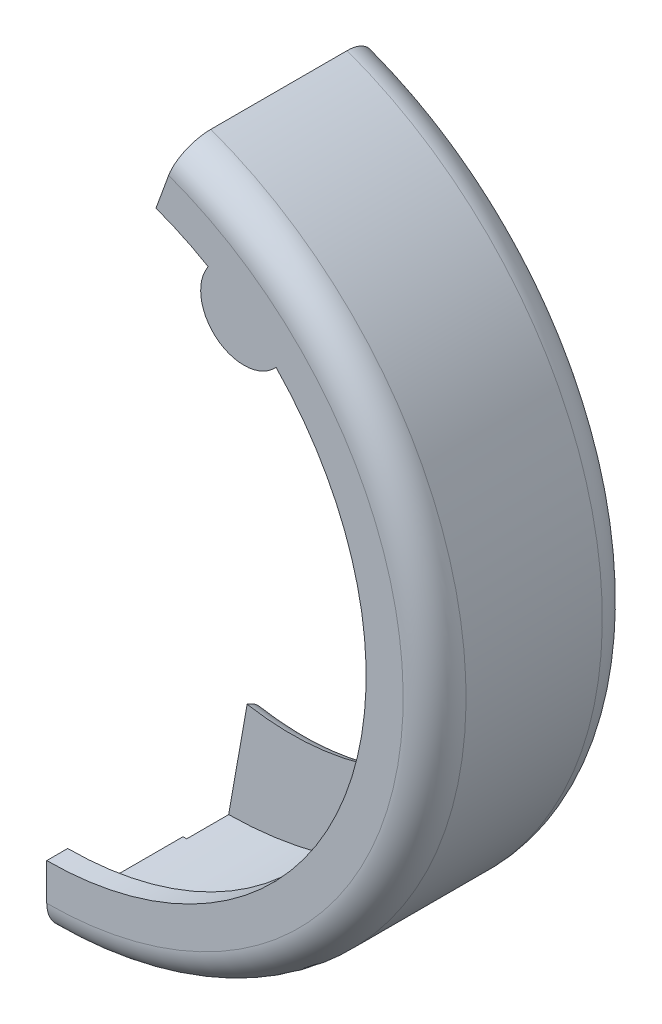
ISO-10303-21;
HEADER;
FILE_DESCRIPTION(('STEP AP214'),'2;1');
FILE_NAME('part.step','',(''),(''),'','','');
FILE_SCHEMA(('AUTOMOTIVE_DESIGN { 1 0 10303 214 1 1 1 1 }'));
ENDSEC;
DATA;
#1=APPLICATION_CONTEXT('core data for automotive mechanical design processes');
#2=APPLICATION_PROTOCOL_DEFINITION('international standard','automotive_design',2000,#1);
#3=PRODUCT_CONTEXT('',#1,'mechanical');
#4=PRODUCT('Part','Part','',(#3));
#5=PRODUCT_RELATED_PRODUCT_CATEGORY('part','',(#4));
#6=PRODUCT_DEFINITION_FORMATION('','',#4);
#7=PRODUCT_DEFINITION_CONTEXT('part definition',#1,'design');
#8=PRODUCT_DEFINITION('design','',#6,#7);
#9=PRODUCT_DEFINITION_SHAPE('','',#8);
#10=(LENGTH_UNIT() NAMED_UNIT(*) SI_UNIT(.MILLI.,.METRE.));
#11=(NAMED_UNIT(*) PLANE_ANGLE_UNIT() SI_UNIT($,.RADIAN.));
#12=(NAMED_UNIT(*) SI_UNIT($,.STERADIAN.) SOLID_ANGLE_UNIT());
#13=UNCERTAINTY_MEASURE_WITH_UNIT(LENGTH_MEASURE(1.E-05),#10,'distance_accuracy_value','');
#14=(GEOMETRIC_REPRESENTATION_CONTEXT(3) GLOBAL_UNCERTAINTY_ASSIGNED_CONTEXT((#13)) GLOBAL_UNIT_ASSIGNED_CONTEXT((#10,
#11,#12)) REPRESENTATION_CONTEXT('',''));
#15=CARTESIAN_POINT('',(0.,0.,0.));
#16=DIRECTION('',(0.,0.,1.));
#17=DIRECTION('',(1.,0.,0.));
#18=AXIS2_PLACEMENT_3D('',#15,#16,#17);
#19=CARTESIAN_POINT('',(12.6547453030495,59.7686269690787,-119.437751032146));
#20=DIRECTION('',(-0.984807753012209,0.173648177666927,0.));
#21=DIRECTION('',(-0.173648177666927,-0.984807753012209,0.));
#22=AXIS2_PLACEMENT_3D('',#19,#20,#21);
#23=PLANE('',#22);
#24=DIRECTION('',(0.173648177666927,0.984807753012209,0.));
#25=VECTOR('',#24,1.);
#26=CARTESIAN_POINT('',(12.6547453030495,59.7686269690787,8.00000000000001));
#27=LINE('',#26,#25);
#28=CARTESIAN_POINT('',(11.0299727504239,50.5540839303588,8.00000000000001));
#29=VERTEX_POINT('',#28);
#30=CARTESIAN_POINT('',(12.1250367315628,56.7645003779101,8.00000000000001));
#31=VERTEX_POINT('',#30);
#32=EDGE_CURVE('E314',#29,#31,#27,.T.);
#33=ORIENTED_EDGE('',*,*,#32,.F.);
#34=CARTESIAN_POINT('',(11.0299727504239,50.5540839303588,11.));
#35=DIRECTION('',(-0.984807753012209,0.173648177666927,0.));
#36=DIRECTION('',(-0.173648177666927,-0.984807753012209,0.));
#37=AXIS2_PLACEMENT_3D('',#34,#35,#36);
#38=CIRCLE('',#37,3.);
#39=CARTESIAN_POINT('',(10.538821534548,47.7686269690787,10.));
#40=VERTEX_POINT('',#39);
#41=EDGE_CURVE('E11',#29,#40,#38,.T.);
#42=ORIENTED_EDGE('',*,*,#41,.T.);
#43=DIRECTION('',(-0.173648177666927,-0.984807753012209,0.));
#44=VECTOR('',#43,1.);
#45=CARTESIAN_POINT('',(12.3127251597239,57.8289343482928,10.));
#46=LINE('',#45,#44);
#47=CARTESIAN_POINT('',(12.3017775062236,57.7668471200293,10.));
#48=VERTEX_POINT('',#47);
#49=EDGE_CURVE('E156',#48,#40,#46,.T.);
#50=ORIENTED_EDGE('',*,*,#49,.F.);
#51=DIRECTION('',(0.,0.,-1.));
#52=VECTOR('',#51,1.);
#53=CARTESIAN_POINT('',(12.3017775062236,57.7668471200293,25.));
#54=LINE('',#53,#52);
#55=CARTESIAN_POINT('',(12.3017775062236,57.7668471200293,14.));
#56=VERTEX_POINT('',#55);
#57=EDGE_CURVE('E215',#56,#48,#54,.T.);
#58=ORIENTED_EDGE('',*,*,#57,.F.);
#59=DIRECTION('',(0.173648177666927,0.984807753012209,0.));
#60=VECTOR('',#59,1.);
#61=CARTESIAN_POINT('',(12.6547453030495,59.7686269690787,14.));
#62=LINE('',#61,#60);
#63=CARTESIAN_POINT('',(12.6547453030495,59.7686269690787,14.));
#64=VERTEX_POINT('',#63);
#65=EDGE_CURVE('E320',#56,#64,#62,.T.);
#66=ORIENTED_EDGE('',*,*,#65,.T.);
#67=DIRECTION('',(0.,0.,1.));
#68=VECTOR('',#67,1.);
#69=CARTESIAN_POINT('',(12.6547453030495,59.7686269690787,-119.437751032146));
#70=LINE('',#69,#68);
#71=CARTESIAN_POINT('',(12.6547453030495,59.7686269690787,11.));
#72=VERTEX_POINT('',#71);
#73=EDGE_CURVE('E163',#72,#64,#70,.T.);
#74=ORIENTED_EDGE('',*,*,#73,.F.);
#75=CARTESIAN_POINT('',(12.6547453030495,59.7686269690787,11.));
#76=CARTESIAN_POINT('',(12.6547468349805,59.7686356570912,10.9165733466822));
#77=CARTESIAN_POINT('',(12.6541316964443,59.7651470330942,10.8331508871102));
#78=CARTESIAN_POINT('',(12.6516799060763,59.7512422389546,10.6669095493792));
#79=CARTESIAN_POINT('',(12.6498433472594,59.7408265963257,10.5840906257444));
#80=CARTESIAN_POINT('',(12.6449633705705,59.7131508732497,10.4197339816552));
#81=CARTESIAN_POINT('',(12.6419213540951,59.6958987405177,10.3381948873735));
#82=CARTESIAN_POINT('',(12.6346569704971,59.6547003738874,10.1769035838406));
#83=CARTESIAN_POINT('',(12.6304346115,59.6307541860716,10.0971513622925));
#84=CARTESIAN_POINT('',(12.6160359903042,59.5490955474564,9.86136379935834));
#85=CARTESIAN_POINT('',(12.6041254773856,59.4815476720787,9.7087070588601));
#86=CARTESIAN_POINT('',(12.5760571256805,59.3223641393469,9.41707776149561));
#87=CARTESIAN_POINT('',(12.5598995543829,59.2307299989975,9.27810434358178));
#88=CARTESIAN_POINT('',(12.5236959113148,59.0254089362613,9.01665426272462));
#89=CARTESIAN_POINT('',(12.5036260217044,58.9115869361922,8.89428685496378));
#90=CARTESIAN_POINT('',(12.4602460243751,58.6655667460037,8.67034273241371));
#91=CARTESIAN_POINT('',(12.4369352357001,58.5333646939903,8.56877039806553));
#92=CARTESIAN_POINT('',(12.387377003203,58.2523059910169,8.38771300665326));
#93=CARTESIAN_POINT('',(12.3610914948549,58.1032334654031,8.30857383460427));
#94=CARTESIAN_POINT('',(12.3066140589155,57.7942765733802,8.17641338535062));
#95=CARTESIAN_POINT('',(12.2784227577457,57.6343957595845,8.12338357318629));
#96=CARTESIAN_POINT('',(12.2292674572776,57.3556221977023,8.05610578315802));
#97=CARTESIAN_POINT('',(12.208575040323,57.2382696696238,8.03507387164041));
#98=CARTESIAN_POINT('',(12.1669363016411,57.0021246479453,8.00702163326347));
#99=CARTESIAN_POINT('',(12.1459903934288,56.8833344995051,7.99998095176575));
#100=CARTESIAN_POINT('',(12.1250367315628,56.7645003779101,8.));
#101=B_SPLINE_CURVE_WITH_KNOTS('',3,(#75,#76,#77,#78,#79,#80,#81,#82,#83,#84,#85,#86,#87,#88,
#89,#90,#91,#92,#93,#94,#95,#96,#97,#98,#99,#100),.UNSPECIFIED.,.F.,.F.,(4,2,2,2,2,2,2,2,2,2,2,
2,4),(0.,0.250197316126617,0.500375581137329,0.750263852364501,1.0001504033767,1.49965147709577,
1.99912109869959,2.50173217166488,3.00444900997055,3.51454081232796,4.02446575849611,
4.38670207520872,4.74841101849499),.UNSPECIFIED.);
#102=EDGE_CURVE('E234',#72,#31,#101,.T.);
#103=ORIENTED_EDGE('',*,*,#102,.T.);
#104=EDGE_LOOP('',(#33,#42,#50,#58,#66,#74,#103));
#105=FACE_BOUND('',#104,.T.);
#106=ADVANCED_FACE('F39',(#105),#23,.T.);
#107=CARTESIAN_POINT('',(11.9707050163982,57.8892417275069,10.));
#108=DIRECTION('',(0.,0.,1.));
#109=DIRECTION('',(1.,0.,0.));
#110=AXIS2_PLACEMENT_3D('',#107,#108,#109);
#111=PLANE('',#110);
#112=ORIENTED_EDGE('',*,*,#49,.T.);
#113=CARTESIAN_POINT('',(6.32737265152477,23.8843134845393,10.));
#114=DIRECTION('',(0.,0.,1.));
#115=DIRECTION('',(1.,0.,0.));
#116=AXIS2_PLACEMENT_3D('',#113,#114,#115);
#117=CIRCLE('',#116,24.2527675188228);
#118=CARTESIAN_POINT('',(2.11592376850154,0.,10.));
#119=VERTEX_POINT('',#118);
#120=EDGE_CURVE('E146',#40,#119,#117,.F.);
#121=ORIENTED_EDGE('',*,*,#120,.T.);
#122=CARTESIAN_POINT('',(0.35296779682592,-9.99822015095059,10.));
#123=VERTEX_POINT('',#122);
#124=EDGE_CURVE('E153',#119,#123,#46,.T.);
#125=ORIENTED_EDGE('',*,*,#124,.T.);
#126=CARTESIAN_POINT('',(0.,25.,10.));
#127=DIRECTION('',(0.,0.,-1.));
#128=DIRECTION('',(-1.,0.,0.));
#129=AXIS2_PLACEMENT_3D('',#126,#127,#128);
#130=CIRCLE('',#129,35.);
#131=EDGE_CURVE('E193',#48,#123,#130,.T.);
#132=ORIENTED_EDGE('',*,*,#131,.F.);
#133=EDGE_LOOP('',(#112,#121,#125,#132));
#134=FACE_BOUND('',#133,.T.);
#135=ADVANCED_FACE('F151',(#134),#111,.T.);
#136=CARTESIAN_POINT('',(11.9707050163982,57.8892417275069,8.));
#137=DIRECTION('',(0.,0.,1.));
#138=DIRECTION('',(1.,0.,0.));
#139=AXIS2_PLACEMENT_3D('',#136,#137,#138);
#140=PLANE('',#139);
#141=CARTESIAN_POINT('',(0.529708571486751,-8.99587340883146,8.00000000000001));
#142=VERTEX_POINT('',#141);
#143=CARTESIAN_POINT('',(1.62477255262566,-2.78545696128008,8.00000000000001));
#144=VERTEX_POINT('',#143);
#145=EDGE_CURVE('E318',#142,#144,#27,.T.);
#146=ORIENTED_EDGE('',*,*,#145,.T.);
#147=CARTESIAN_POINT('',(6.32737265152477,23.8843134845393,8.));
#148=DIRECTION('',(0.,0.,1.));
#149=DIRECTION('',(1.,0.,0.));
#150=AXIS2_PLACEMENT_3D('',#147,#148,#149);
#151=CIRCLE('',#150,27.081194643569);
#152=EDGE_CURVE('E47',#144,#29,#151,.T.);
#153=ORIENTED_EDGE('',*,*,#152,.T.);
#154=ORIENTED_EDGE('',*,*,#32,.T.);
#155=CARTESIAN_POINT('',(0.,25.,8.));
#156=DIRECTION('',(0.,0.,1.));
#157=DIRECTION('',(1.,0.,0.));
#158=AXIS2_PLACEMENT_3D('',#155,#156,#157);
#159=CIRCLE('',#158,34.);
#160=EDGE_CURVE('E231',#31,#142,#159,.F.);
#161=ORIENTED_EDGE('',*,*,#160,.T.);
#162=EDGE_LOOP('',(#146,#153,#154,#161));
#163=FACE_BOUND('',#162,.T.);
#164=ADVANCED_FACE('F268',(#163),#140,.F.);
#165=CARTESIAN_POINT('',(0.,25.,133.187751032146));
#166=DIRECTION('',(0.,0.,-1.));
#167=DIRECTION('',(-1.,0.,0.));
#168=AXIS2_PLACEMENT_3D('',#165,#166,#167);
#169=CYLINDRICAL_SURFACE('',#168,30.4718695930204);
#170=CARTESIAN_POINT('',(0.,25.,27.));
#171=DIRECTION('',(0.,0.,-1.));
#172=DIRECTION('',(-1.,0.,0.));
#173=AXIS2_PLACEMENT_3D('',#170,#171,#172);
#174=CIRCLE('',#173,30.4718695930204);
#175=CARTESIAN_POINT('',(0.,-5.47186959302042,27.));
#176=VERTEX_POINT('',#175);
#177=CARTESIAN_POINT('',(21.8744150413845,46.2142594283018,27.));
#178=VERTEX_POINT('',#177);
#179=EDGE_CURVE('E172',#176,#178,#174,.F.);
#180=ORIENTED_EDGE('',*,*,#179,.T.);
#181=DIRECTION('',(0.,0.,1.));
#182=VECTOR('',#181,1.);
#183=CARTESIAN_POINT('',(21.8744150413845,46.2142594283018,26.));
#184=LINE('',#183,#182);
#185=CARTESIAN_POINT('',(21.8744150413845,46.2142594283018,25.));
#186=VERTEX_POINT('',#185);
#187=EDGE_CURVE('E220',#178,#186,#184,.F.);
#188=ORIENTED_EDGE('',*,*,#187,.T.);
#189=CARTESIAN_POINT('',(0.,25.,25.));
#190=DIRECTION('',(0.,0.,-1.));
#191=DIRECTION('',(-1.,0.,0.));
#192=AXIS2_PLACEMENT_3D('',#189,#190,#191);
#193=CIRCLE('',#192,30.4718695930204);
#194=CARTESIAN_POINT('',(0.,-5.47186959302042,25.));
#195=VERTEX_POINT('',#194);
#196=EDGE_CURVE('E205',#186,#195,#193,.T.);
#197=ORIENTED_EDGE('',*,*,#196,.T.);
#198=DIRECTION('',(0.,0.,-1.));
#199=VECTOR('',#198,1.);
#200=CARTESIAN_POINT('',(0.,-5.47186959302042,133.187751032146));
#201=LINE('',#200,#199);
#202=EDGE_CURVE('E174',#176,#195,#201,.T.);
#203=ORIENTED_EDGE('',*,*,#202,.F.);
#204=EDGE_LOOP('',(#180,#188,#197,#203));
#205=FACE_BOUND('',#204,.T.);
#206=ADVANCED_FACE('F271',(#205),#169,.F.);
#207=CARTESIAN_POINT('',(0.,25.,25.));
#208=DIRECTION('',(0.,0.,-1.));
#209=DIRECTION('',(-1.,0.,0.));
#210=AXIS2_PLACEMENT_3D('',#207,#208,#209);
#211=CYLINDRICAL_SURFACE('',#210,35.);
#212=CARTESIAN_POINT('',(0.,25.,14.));
#213=DIRECTION('',(0.,0.,1.));
#214=DIRECTION('',(1.,0.,0.));
#215=AXIS2_PLACEMENT_3D('',#212,#213,#214);
#216=CIRCLE('',#215,35.);
#217=CARTESIAN_POINT('',(11.9707050163982,57.8892417275069,14.));
#218=VERTEX_POINT('',#217);
#219=EDGE_CURVE('E213',#56,#218,#216,.T.);
#220=ORIENTED_EDGE('',*,*,#219,.F.);
#221=ORIENTED_EDGE('',*,*,#57,.T.);
#222=ORIENTED_EDGE('',*,*,#131,.T.);
#223=DIRECTION('',(0.,0.,-1.));
#224=VECTOR('',#223,1.);
#225=CARTESIAN_POINT('',(0.35296779682592,-9.99822015095059,25.));
#226=LINE('',#225,#224);
#227=CARTESIAN_POINT('',(0.35296779682592,-9.99822015095059,14.));
#228=VERTEX_POINT('',#227);
#229=EDGE_CURVE('E162',#123,#228,#226,.F.);
#230=ORIENTED_EDGE('',*,*,#229,.T.);
#231=CARTESIAN_POINT('',(0.,-10.,14.));
#232=VERTEX_POINT('',#231);
#233=EDGE_CURVE('E210',#232,#228,#216,.T.);
#234=ORIENTED_EDGE('',*,*,#233,.F.);
#235=DIRECTION('',(0.,0.,-1.));
#236=VECTOR('',#235,1.);
#237=CARTESIAN_POINT('',(0.,-10.,25.));
#238=LINE('',#237,#236);
#239=CARTESIAN_POINT('',(0.,-10.,25.));
#240=VERTEX_POINT('',#239);
#241=EDGE_CURVE('E182',#240,#232,#238,.T.);
#242=ORIENTED_EDGE('',*,*,#241,.F.);
#243=CARTESIAN_POINT('',(0.,25.,25.));
#244=DIRECTION('',(0.,0.,-1.));
#245=DIRECTION('',(-1.,0.,0.));
#246=AXIS2_PLACEMENT_3D('',#243,#244,#245);
#247=CIRCLE('',#246,35.);
#248=CARTESIAN_POINT('',(11.9707050163982,57.8892417275069,25.));
#249=VERTEX_POINT('',#248);
#250=EDGE_CURVE('E190',#249,#240,#247,.T.);
#251=ORIENTED_EDGE('',*,*,#250,.F.);
#252=DIRECTION('',(0.,0.,-1.));
#253=VECTOR('',#252,1.);
#254=CARTESIAN_POINT('',(11.9707050163982,57.8892417275069,25.));
#255=LINE('',#254,#253);
#256=EDGE_CURVE('E187',#249,#218,#255,.T.);
#257=ORIENTED_EDGE('',*,*,#256,.T.);
#258=EDGE_LOOP('',(#220,#221,#222,#230,#234,#242,#251,#257));
#259=FACE_BOUND('',#258,.T.);
#260=ADVANCED_FACE('F279',(#259),#211,.F.);
#261=CARTESIAN_POINT('',(8.55050358314158,48.4923155196478,0.));
#262=DIRECTION('',(0.93969262078591,-0.342020143325663,0.));
#263=DIRECTION('',(0.,0.,1.));
#264=AXIS2_PLACEMENT_3D('',#261,#262,#263);
#265=PLANE('',#264);
#266=DIRECTION('',(0.342020143325663,0.939692620785911,0.));
#267=VECTOR('',#266,1.);
#268=CARTESIAN_POINT('',(8.55050358314158,48.4923155196478,27.));
#269=LINE('',#268,#267);
#270=CARTESIAN_POINT('',(10.4219932056058,53.6341909981119,27.));
#271=VERTEX_POINT('',#270);
#272=CARTESIAN_POINT('',(11.6286848730725,56.949549106721,27.));
#273=VERTEX_POINT('',#272);
#274=EDGE_CURVE('E199',#271,#273,#269,.T.);
#275=ORIENTED_EDGE('',*,*,#274,.T.);
#276=CARTESIAN_POINT('',(11.6286848730725,56.949549106721,24.));
#277=DIRECTION('',(0.93969262078591,-0.342020143325663,0.));
#278=DIRECTION('',(0.342020143325663,0.939692620785911,0.));
#279=AXIS2_PLACEMENT_3D('',#276,#277,#278);
#280=CIRCLE('',#279,3.);
#281=CARTESIAN_POINT('',(12.6547453030495,59.7686269690787,24.));
#282=VERTEX_POINT('',#281);
#283=EDGE_CURVE('E229',#273,#282,#280,.F.);
#284=ORIENTED_EDGE('',*,*,#283,.T.);
#285=DIRECTION('',(0.,0.,-1.));
#286=VECTOR('',#285,1.);
#287=CARTESIAN_POINT('',(12.6547453030495,59.7686269690787,27.));
#288=LINE('',#287,#286);
#289=EDGE_CURVE('E202',#282,#64,#288,.T.);
#290=ORIENTED_EDGE('',*,*,#289,.T.);
#291=DIRECTION('',(-0.342020143325663,-0.939692620785911,0.));
#292=VECTOR('',#291,1.);
#293=CARTESIAN_POINT('',(8.55050358314158,48.4923155196478,14.));
#294=LINE('',#293,#292);
#295=EDGE_CURVE('E170',#64,#218,#294,.T.);
#296=ORIENTED_EDGE('',*,*,#295,.T.);
#297=ORIENTED_EDGE('',*,*,#256,.F.);
#298=DIRECTION('',(0.342020143325663,0.93969262078591,0.));
#299=VECTOR('',#298,1.);
#300=CARTESIAN_POINT('',(11.9707050163982,57.8892417275069,25.));
#301=LINE('',#300,#299);
#302=CARTESIAN_POINT('',(10.4219932056058,53.6341909981119,25.));
#303=VERTEX_POINT('',#302);
#304=EDGE_CURVE('E185',#303,#249,#301,.T.);
#305=ORIENTED_EDGE('',*,*,#304,.F.);
#306=DIRECTION('',(0.,0.,-1.));
#307=VECTOR('',#306,1.);
#308=CARTESIAN_POINT('',(10.4219932056058,53.6341909981119,133.187751032146));
#309=LINE('',#308,#307);
#310=EDGE_CURVE('E177',#271,#303,#309,.T.);
#311=ORIENTED_EDGE('',*,*,#310,.F.);
#312=EDGE_LOOP('',(#275,#284,#290,#296,#297,#305,#311));
#313=FACE_BOUND('',#312,.T.);
#314=ADVANCED_FACE('F276',(#313),#265,.F.);
#315=CARTESIAN_POINT('',(0.,0.,0.));
#316=DIRECTION('',(-1.,0.,0.));
#317=DIRECTION('',(0.,0.,1.));
#318=AXIS2_PLACEMENT_3D('',#315,#316,#317);
#319=PLANE('',#318);
#320=DIRECTION('',(0.,0.,-1.));
#321=VECTOR('',#320,1.);
#322=CARTESIAN_POINT('',(0.,-12.,27.));
#323=LINE('',#322,#321);
#324=CARTESIAN_POINT('',(0.,-12.,24.));
#325=VERTEX_POINT('',#324);
#326=CARTESIAN_POINT('',(0.,-12.,14.));
#327=VERTEX_POINT('',#326);
#328=EDGE_CURVE('E198',#325,#327,#323,.T.);
#329=ORIENTED_EDGE('',*,*,#328,.F.);
#330=CARTESIAN_POINT('',(0.,-9.,24.));
#331=DIRECTION('',(-1.,0.,0.));
#332=DIRECTION('',(0.,0.,1.));
#333=AXIS2_PLACEMENT_3D('',#330,#331,#332);
#334=CIRCLE('',#333,3.);
#335=CARTESIAN_POINT('',(0.,-9.,27.));
#336=VERTEX_POINT('',#335);
#337=EDGE_CURVE('E225',#325,#336,#334,.T.);
#338=ORIENTED_EDGE('',*,*,#337,.T.);
#339=DIRECTION('',(0.,-1.,0.));
#340=VECTOR('',#339,1.);
#341=CARTESIAN_POINT('',(0.,0.,27.));
#342=LINE('',#341,#340);
#343=EDGE_CURVE('E195',#176,#336,#342,.T.);
#344=ORIENTED_EDGE('',*,*,#343,.F.);
#345=ORIENTED_EDGE('',*,*,#202,.T.);
#346=DIRECTION('',(0.,-1.,0.));
#347=VECTOR('',#346,1.);
#348=CARTESIAN_POINT('',(0.,-10.,25.));
#349=LINE('',#348,#347);
#350=EDGE_CURVE('E180',#195,#240,#349,.T.);
#351=ORIENTED_EDGE('',*,*,#350,.T.);
#352=ORIENTED_EDGE('',*,*,#241,.T.);
#353=DIRECTION('',(0.,1.,0.));
#354=VECTOR('',#353,1.);
#355=CARTESIAN_POINT('',(0.,0.,14.));
#356=LINE('',#355,#354);
#357=EDGE_CURVE('E321',#327,#232,#356,.T.);
#358=ORIENTED_EDGE('',*,*,#357,.F.);
#359=EDGE_LOOP('',(#329,#338,#344,#345,#351,#352,#358));
#360=FACE_BOUND('',#359,.T.);
#361=ADVANCED_FACE('F274',(#360),#319,.T.);
#362=CARTESIAN_POINT('',(11.9707050163982,57.8892417275069,27.));
#363=DIRECTION('',(0.,0.,-1.));
#364=DIRECTION('',(-1.,0.,0.));
#365=AXIS2_PLACEMENT_3D('',#362,#363,#364);
#366=PLANE('',#365);
#367=ORIENTED_EDGE('',*,*,#343,.T.);
#368=CARTESIAN_POINT('',(0.,25.,27.));
#369=DIRECTION('',(0.,0.,-1.));
#370=DIRECTION('',(-1.,0.,0.));
#371=AXIS2_PLACEMENT_3D('',#368,#369,#370);
#372=CIRCLE('',#371,34.);
#373=EDGE_CURVE('E227',#336,#273,#372,.F.);
#374=ORIENTED_EDGE('',*,*,#373,.T.);
#375=ORIENTED_EDGE('',*,*,#274,.F.);
#376=CARTESIAN_POINT('',(15.4000926246408,51.2939533666302,27.));
#377=VERTEX_POINT('',#376);
#378=EDGE_CURVE('E165',#377,#271,#174,.F.);
#379=ORIENTED_EDGE('',*,*,#378,.F.);
#380=CARTESIAN_POINT('',(18.8095202773202,48.9736685434483,27.));
#381=DIRECTION('',(0.,0.,1.));
#382=DIRECTION('',(1.,0.,0.));
#383=AXIS2_PLACEMENT_3D('',#380,#381,#382);
#384=CIRCLE('',#383,4.12406578264009);
#385=EDGE_CURVE('E157',#377,#178,#384,.T.);
#386=ORIENTED_EDGE('',*,*,#385,.T.);
#387=ORIENTED_EDGE('',*,*,#179,.F.);
#388=EDGE_LOOP('',(#367,#374,#375,#379,#386,#387));
#389=FACE_BOUND('',#388,.T.);
#390=ADVANCED_FACE('F266',(#389),#366,.F.);
#391=CARTESIAN_POINT('',(0.,25.,25.));
#392=DIRECTION('',(0.,0.,-1.));
#393=DIRECTION('',(-1.,0.,0.));
#394=AXIS2_PLACEMENT_3D('',#391,#392,#393);
#395=CYLINDRICAL_SURFACE('',#394,37.);
#396=DIRECTION('',(0.,0.,1.));
#397=VECTOR('',#396,1.);
#398=CARTESIAN_POINT('',(0.,-12.,-119.437751032146));
#399=LINE('',#398,#397);
#400=CARTESIAN_POINT('',(0.,-12.,11.));
#401=VERTEX_POINT('',#400);
#402=EDGE_CURVE('E166',#401,#327,#399,.T.);
#403=ORIENTED_EDGE('',*,*,#402,.F.);
#404=CARTESIAN_POINT('',(0.,25.,11.));
#405=DIRECTION('',(0.,0.,1.));
#406=DIRECTION('',(1.,0.,0.));
#407=AXIS2_PLACEMENT_3D('',#404,#405,#406);
#408=CIRCLE('',#407,37.);
#409=EDGE_CURVE('E147',#401,#72,#408,.T.);
#410=ORIENTED_EDGE('',*,*,#409,.T.);
#411=ORIENTED_EDGE('',*,*,#73,.T.);
#412=ORIENTED_EDGE('',*,*,#289,.F.);
#413=CARTESIAN_POINT('',(0.,25.,24.));
#414=DIRECTION('',(0.,0.,-1.));
#415=DIRECTION('',(-1.,0.,0.));
#416=AXIS2_PLACEMENT_3D('',#413,#414,#415);
#417=CIRCLE('',#416,37.);
#418=EDGE_CURVE('E222',#282,#325,#417,.T.);
#419=ORIENTED_EDGE('',*,*,#418,.T.);
#420=ORIENTED_EDGE('',*,*,#328,.T.);
#421=EDGE_LOOP('',(#403,#410,#411,#412,#419,#420));
#422=FACE_BOUND('',#421,.T.);
#423=ADVANCED_FACE('F262',(#422),#395,.T.);
#424=CARTESIAN_POINT('',(11.9707050163982,57.8892417275069,25.));
#425=DIRECTION('',(0.,0.,-1.));
#426=DIRECTION('',(-1.,0.,0.));
#427=AXIS2_PLACEMENT_3D('',#424,#425,#426);
#428=PLANE('',#427);
#429=ORIENTED_EDGE('',*,*,#196,.F.);
#430=CARTESIAN_POINT('',(18.8095202773202,48.9736685434483,25.));
#431=DIRECTION('',(0.,0.,1.));
#432=DIRECTION('',(1.,0.,0.));
#433=AXIS2_PLACEMENT_3D('',#430,#431,#432);
#434=CIRCLE('',#433,4.12406578264009);
#435=CARTESIAN_POINT('',(15.4000926246408,51.2939533666302,25.));
#436=VERTEX_POINT('',#435);
#437=EDGE_CURVE('E326',#436,#186,#434,.T.);
#438=ORIENTED_EDGE('',*,*,#437,.F.);
#439=EDGE_CURVE('E208',#303,#436,#193,.T.);
#440=ORIENTED_EDGE('',*,*,#439,.F.);
#441=ORIENTED_EDGE('',*,*,#304,.T.);
#442=ORIENTED_EDGE('',*,*,#250,.T.);
#443=ORIENTED_EDGE('',*,*,#350,.F.);
#444=EDGE_LOOP('',(#429,#438,#440,#441,#442,#443));
#445=FACE_BOUND('',#444,.T.);
#446=ADVANCED_FACE('F265',(#445),#428,.T.);
#447=ORIENTED_EDGE('',*,*,#439,.T.);
#448=DIRECTION('',(0.,0.,1.));
#449=VECTOR('',#448,1.);
#450=CARTESIAN_POINT('',(15.4000926246408,51.2939533666302,26.));
#451=LINE('',#450,#449);
#452=EDGE_CURVE('E217',#436,#377,#451,.T.);
#453=ORIENTED_EDGE('',*,*,#452,.T.);
#454=ORIENTED_EDGE('',*,*,#378,.T.);
#455=ORIENTED_EDGE('',*,*,#310,.T.);
#456=EDGE_LOOP('',(#447,#453,#454,#455));
#457=FACE_BOUND('',#456,.T.);
#458=ADVANCED_FACE('F291',(#457),#169,.F.);
#459=CARTESIAN_POINT('',(11.9707050163982,57.8892417275069,14.));
#460=DIRECTION('',(0.,0.,1.));
#461=DIRECTION('',(1.,0.,0.));
#462=AXIS2_PLACEMENT_3D('',#459,#460,#461);
#463=PLANE('',#462);
#464=ORIENTED_EDGE('',*,*,#65,.F.);
#465=ORIENTED_EDGE('',*,*,#219,.T.);
#466=ORIENTED_EDGE('',*,*,#295,.F.);
#467=EDGE_LOOP('',(#464,#465,#466));
#468=FACE_BOUND('',#467,.T.);
#469=ADVANCED_FACE('F294',(#468),#463,.F.);
#470=ORIENTED_EDGE('',*,*,#124,.F.);
#471=CARTESIAN_POINT('',(1.62477255262566,-2.78545696128008,11.));
#472=DIRECTION('',(-0.984807753012209,0.173648177666927,0.));
#473=DIRECTION('',(-0.173648177666927,-0.984807753012209,0.));
#474=AXIS2_PLACEMENT_3D('',#471,#472,#473);
#475=CIRCLE('',#474,3.);
#476=EDGE_CURVE('E61',#119,#144,#475,.T.);
#477=ORIENTED_EDGE('',*,*,#476,.T.);
#478=ORIENTED_EDGE('',*,*,#145,.F.);
#479=CARTESIAN_POINT('',(0.529708571486753,-8.99587340883146,8.));
#480=CARTESIAN_POINT('',(0.514615425197804,-9.08147089498079,7.99999270437285));
#481=CARTESIAN_POINT('',(0.499522780701287,-9.16706553532384,8.00364250523255));
#482=CARTESIAN_POINT('',(0.469443529948969,-9.33765344326319,8.01820605095623));
#483=CARTESIAN_POINT('',(0.454456923789838,-9.42264671031125,8.0291198024416));
#484=CARTESIAN_POINT('',(0.424697660683508,-9.5914198781314,8.05815822085685));
#485=CARTESIAN_POINT('',(0.4099249633329,-9.67520000804262,8.07628150712936));
#486=CARTESIAN_POINT('',(0.380700757581157,-9.84093871481525,8.1196104233006));
#487=CARTESIAN_POINT('',(0.366249241798914,-9.92289733353701,8.14481589026099));
#488=CARTESIAN_POINT('',(0.323509996341177,-10.1652836392857,8.23089864561391));
#489=CARTESIAN_POINT('',(0.295832863128021,-10.3222484616966,8.30224689048105));
#490=CARTESIAN_POINT('',(0.243003048262767,-10.6218612302756,8.47088357859572));
#491=CARTESIAN_POINT('',(0.217849481673809,-10.7645141951702,8.56816288455134));
#492=CARTESIAN_POINT('',(0.171016883297646,-11.0301150589064,8.78503194391002));
#493=CARTESIAN_POINT('',(0.149307284152258,-11.1532363138508,8.90440234311716));
#494=CARTESIAN_POINT('',(0.109741478062053,-11.3776251506087,9.16277396499802));
#495=CARTESIAN_POINT('',(0.0918859141800524,-11.4788890854317,9.30177845731546));
#496=CARTESIAN_POINT('',(0.0608405613048896,-11.6549560307762,9.59306393174963));
#497=CARTESIAN_POINT('',(0.0475814802895907,-11.7301520158831,9.74510031395531));
#498=CARTESIAN_POINT('',(0.0257616669141294,-11.8538983267868,10.0599113860715));
#499=CARTESIAN_POINT('',(0.0171971167956138,-11.9024703041672,10.2226772293562));
#500=CARTESIAN_POINT('',(0.00741802564555554,-11.9579302860189,10.4888971610529));
#501=CARTESIAN_POINT('',(0.00463778691867484,-11.9736978033649,10.5905294665004));
#502=CARTESIAN_POINT('',(0.000929294294314284,-11.9947297101636,10.7947587978226));
#503=CARTESIAN_POINT('',(-1.64560480957178E-06,-12.0000093326886,10.8973542067508));
#504=CARTESIAN_POINT('',(0.,-12.,11.));
#505=B_SPLINE_CURVE_WITH_KNOTS('',3,(#479,#480,#481,#482,#483,#484,#485,#486,#487,#488,#489,
#490,#491,#492,#493,#494,#495,#496,#497,#498,#499,#500,#501,#502,#503,#504),.UNSPECIFIED.,.F.,
.F.,(4,2,2,2,2,2,2,2,2,2,2,2,4),(0.,0.260671760947769,0.521343759508853,0.781965862258029,
1.04258196941641,1.5637327678984,2.0847001713933,2.60074803178631,3.11688193059767,
3.62485710807778,4.1324185669753,4.44056548179517,4.74826450250077),.UNSPECIFIED.);
#506=EDGE_CURVE('E242',#142,#401,#505,.T.);
#507=ORIENTED_EDGE('',*,*,#506,.T.);
#508=ORIENTED_EDGE('',*,*,#402,.T.);
#509=EDGE_CURVE('E324',#327,#228,#62,.T.);
#510=ORIENTED_EDGE('',*,*,#509,.T.);
#511=ORIENTED_EDGE('',*,*,#229,.F.);
#512=EDGE_LOOP('',(#470,#477,#478,#507,#508,#510,#511));
#513=FACE_BOUND('',#512,.T.);
#514=ADVANCED_FACE('F160',(#513),#23,.T.);
#515=ORIENTED_EDGE('',*,*,#357,.T.);
#516=ORIENTED_EDGE('',*,*,#233,.T.);
#517=ORIENTED_EDGE('',*,*,#509,.F.);
#518=EDGE_LOOP('',(#515,#516,#517));
#519=FACE_BOUND('',#518,.T.);
#520=ADVANCED_FACE('F296',(#519),#463,.F.);
#521=CARTESIAN_POINT('',(18.8095202773202,48.9736685434483,25.));
#522=DIRECTION('',(0.,0.,1.));
#523=DIRECTION('',(1.,0.,0.));
#524=AXIS2_PLACEMENT_3D('',#521,#522,#523);
#525=CYLINDRICAL_SURFACE('',#524,4.12406578264009);
#526=ORIENTED_EDGE('',*,*,#187,.F.);
#527=ORIENTED_EDGE('',*,*,#385,.F.);
#528=ORIENTED_EDGE('',*,*,#452,.F.);
#529=ORIENTED_EDGE('',*,*,#437,.T.);
#530=EDGE_LOOP('',(#526,#527,#528,#529));
#531=FACE_BOUND('',#530,.T.);
#532=ADVANCED_FACE('F260',(#531),#525,.T.);
#533=CARTESIAN_POINT('',(0.,25.,24.));
#534=DIRECTION('',(0.,0.,-1.));
#535=DIRECTION('',(-1.,0.,0.));
#536=AXIS2_PLACEMENT_3D('',#533,#534,#535);
#537=TOROIDAL_SURFACE('',#536,34.,3.);
#538=ORIENTED_EDGE('',*,*,#283,.F.);
#539=ORIENTED_EDGE('',*,*,#373,.F.);
#540=ORIENTED_EDGE('',*,*,#337,.F.);
#541=ORIENTED_EDGE('',*,*,#418,.F.);
#542=EDGE_LOOP('',(#538,#539,#540,#541));
#543=FACE_BOUND('',#542,.T.);
#544=ADVANCED_FACE('F255',(#543),#537,.T.);
#545=CARTESIAN_POINT('',(0.,25.,11.));
#546=DIRECTION('',(0.,0.,1.));
#547=DIRECTION('',(1.,0.,0.));
#548=AXIS2_PLACEMENT_3D('',#545,#546,#547);
#549=TOROIDAL_SURFACE('',#548,34.,3.);
#550=ORIENTED_EDGE('',*,*,#102,.F.);
#551=ORIENTED_EDGE('',*,*,#409,.F.);
#552=ORIENTED_EDGE('',*,*,#506,.F.);
#553=ORIENTED_EDGE('',*,*,#160,.F.);
#554=EDGE_LOOP('',(#550,#551,#552,#553));
#555=FACE_BOUND('',#554,.T.);
#556=ADVANCED_FACE('F251',(#555),#549,.T.);
#557=CARTESIAN_POINT('',(6.32737265152477,23.8843134845393,11.));
#558=DIRECTION('',(0.,0.,1.));
#559=DIRECTION('',(1.,0.,0.));
#560=AXIS2_PLACEMENT_3D('',#557,#558,#559);
#561=TOROIDAL_SURFACE('',#560,27.081194643569,3.);
#562=ORIENTED_EDGE('',*,*,#41,.F.);
#563=ORIENTED_EDGE('',*,*,#152,.F.);
#564=ORIENTED_EDGE('',*,*,#476,.F.);
#565=ORIENTED_EDGE('',*,*,#120,.F.);
#566=EDGE_LOOP('',(#562,#563,#564,#565));
#567=FACE_BOUND('',#566,.T.);
#568=ADVANCED_FACE('F41',(#567),#561,.T.);
#569=CLOSED_SHELL('',(#106,#135,#164,#206,#260,#314,#361,#390,#423,#446,#458,#469,#514,#520,
#532,#544,#556,#568));
#570=MANIFOLD_SOLID_BREP('B2',#569);
#571=ADVANCED_BREP_SHAPE_REPRESENTATION('',(#18,#570),#14);
#572=SHAPE_DEFINITION_REPRESENTATION(#9,#571);
ENDSEC;
END-ISO-10303-21;
